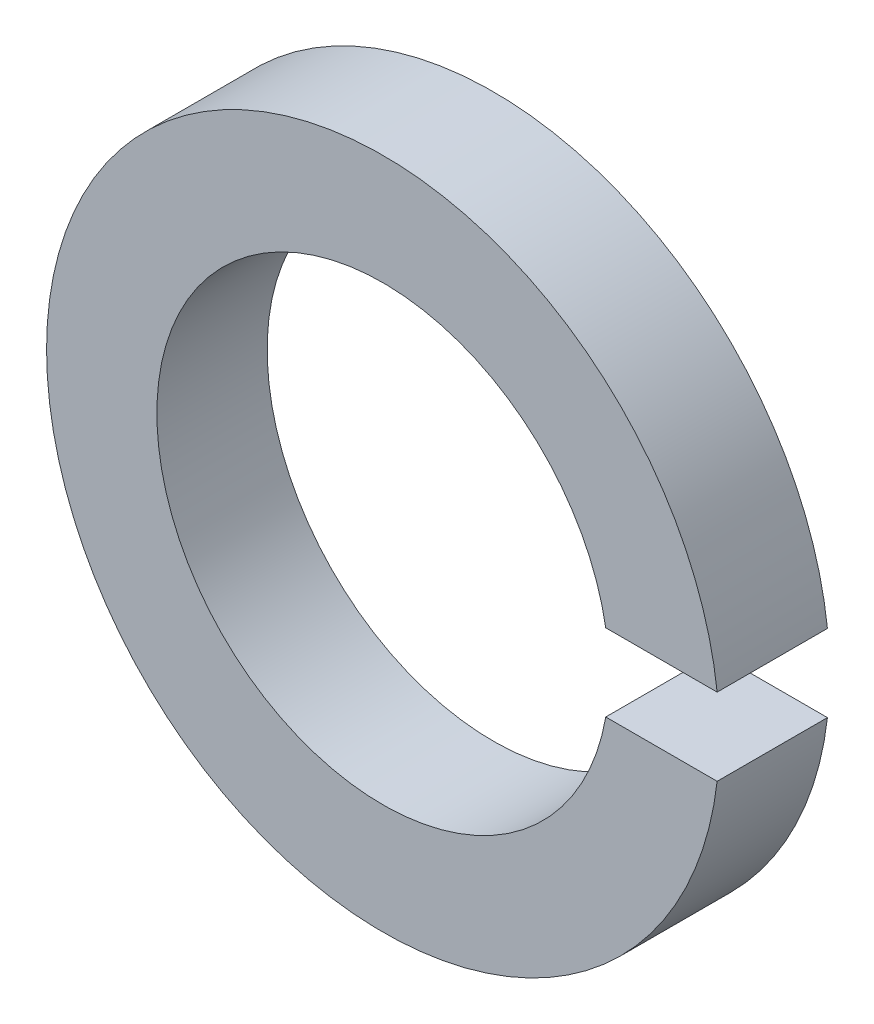
ISO-10303-21;
HEADER;
FILE_DESCRIPTION(('STEP AP214'),'2;1');
FILE_NAME('part.step','',(''),(''),'','','');
FILE_SCHEMA(('AUTOMOTIVE_DESIGN { 1 0 10303 214 1 1 1 1 }'));
ENDSEC;
DATA;
#1=APPLICATION_CONTEXT('core data for automotive mechanical design processes');
#2=APPLICATION_PROTOCOL_DEFINITION('international standard','automotive_design',2000,#1);
#3=PRODUCT_CONTEXT('',#1,'mechanical');
#4=PRODUCT('Part','Part','',(#3));
#5=PRODUCT_RELATED_PRODUCT_CATEGORY('part','',(#4));
#6=PRODUCT_DEFINITION_FORMATION('','',#4);
#7=PRODUCT_DEFINITION_CONTEXT('part definition',#1,'design');
#8=PRODUCT_DEFINITION('design','',#6,#7);
#9=PRODUCT_DEFINITION_SHAPE('','',#8);
#10=(LENGTH_UNIT() NAMED_UNIT(*) SI_UNIT(.MILLI.,.METRE.));
#11=(NAMED_UNIT(*) PLANE_ANGLE_UNIT() SI_UNIT($,.RADIAN.));
#12=(NAMED_UNIT(*) SI_UNIT($,.STERADIAN.) SOLID_ANGLE_UNIT());
#13=UNCERTAINTY_MEASURE_WITH_UNIT(LENGTH_MEASURE(1.E-05),#10,'distance_accuracy_value','');
#14=(GEOMETRIC_REPRESENTATION_CONTEXT(3) GLOBAL_UNCERTAINTY_ASSIGNED_CONTEXT((#13)) GLOBAL_UNIT_ASSIGNED_CONTEXT((#10,
#11,#12)) REPRESENTATION_CONTEXT('',''));
#15=CARTESIAN_POINT('',(0.,0.,0.));
#16=DIRECTION('',(0.,0.,1.));
#17=DIRECTION('',(1.,0.,0.));
#18=AXIS2_PLACEMENT_3D('',#15,#16,#17);
#19=CARTESIAN_POINT('',(0.,0.,1.));
#20=DIRECTION('',(0.,0.,1.));
#21=DIRECTION('',(1.,0.,0.));
#22=AXIS2_PLACEMENT_3D('',#19,#20,#21);
#23=PLANE('',#22);
#24=DIRECTION('',(-1.,0.,0.));
#25=VECTOR('',#24,1.);
#26=CARTESIAN_POINT('',(1.99720507012258,0.35,1.));
#27=LINE('',#26,#25);
#28=CARTESIAN_POINT('',(3.02985148150862,0.35,1.));
#29=VERTEX_POINT('',#28);
#30=CARTESIAN_POINT('',(2.01990098767242,0.35,1.));
#31=VERTEX_POINT('',#30);
#32=EDGE_CURVE('E50',#29,#31,#27,.T.);
#33=ORIENTED_EDGE('',*,*,#32,.F.);
#34=CARTESIAN_POINT('',(0.,0.,1.));
#35=DIRECTION('',(0.,0.,1.));
#36=DIRECTION('',(1.,0.,0.));
#37=AXIS2_PLACEMENT_3D('',#34,#35,#36);
#38=CIRCLE('',#37,3.05);
#39=CARTESIAN_POINT('',(3.02985148150862,-0.35,1.));
#40=VERTEX_POINT('',#39);
#41=EDGE_CURVE('E73',#29,#40,#38,.T.);
#42=ORIENTED_EDGE('',*,*,#41,.T.);
#43=DIRECTION('',(1.,0.,0.));
#44=VECTOR('',#43,1.);
#45=CARTESIAN_POINT('',(1.99720507012258,-0.35,1.));
#46=LINE('',#45,#44);
#47=CARTESIAN_POINT('',(2.01990098767242,-0.35,1.));
#48=VERTEX_POINT('',#47);
#49=EDGE_CURVE('E67',#48,#40,#46,.T.);
#50=ORIENTED_EDGE('',*,*,#49,.F.);
#51=CARTESIAN_POINT('',(0.,0.,1.));
#52=DIRECTION('',(0.,0.,1.));
#53=DIRECTION('',(1.,0.,0.));
#54=AXIS2_PLACEMENT_3D('',#51,#52,#53);
#55=CIRCLE('',#54,2.05);
#56=EDGE_CURVE('E77',#31,#48,#55,.T.);
#57=ORIENTED_EDGE('',*,*,#56,.F.);
#58=EDGE_LOOP('',(#33,#42,#50,#57));
#59=FACE_BOUND('',#58,.T.);
#60=ADVANCED_FACE('F28',(#59),#23,.T.);
#61=CARTESIAN_POINT('',(0.,0.,0.));
#62=DIRECTION('',(0.,0.,1.));
#63=DIRECTION('',(1.,0.,0.));
#64=AXIS2_PLACEMENT_3D('',#61,#62,#63);
#65=PLANE('',#64);
#66=CARTESIAN_POINT('',(0.,0.,0.));
#67=DIRECTION('',(0.,0.,1.));
#68=DIRECTION('',(1.,0.,0.));
#69=AXIS2_PLACEMENT_3D('',#66,#67,#68);
#70=CIRCLE('',#69,3.05);
#71=CARTESIAN_POINT('',(3.02985148150862,0.35,0.));
#72=VERTEX_POINT('',#71);
#73=CARTESIAN_POINT('',(3.02985148150862,-0.35,0.));
#74=VERTEX_POINT('',#73);
#75=EDGE_CURVE('E81',#72,#74,#70,.T.);
#76=ORIENTED_EDGE('',*,*,#75,.F.);
#77=DIRECTION('',(-1.,0.,0.));
#78=VECTOR('',#77,1.);
#79=CARTESIAN_POINT('',(1.99720507012258,0.35,0.));
#80=LINE('',#79,#78);
#81=CARTESIAN_POINT('',(2.01990098767242,0.35,0.));
#82=VERTEX_POINT('',#81);
#83=EDGE_CURVE('E94',#72,#82,#80,.T.);
#84=ORIENTED_EDGE('',*,*,#83,.T.);
#85=CARTESIAN_POINT('',(0.,0.,0.));
#86=DIRECTION('',(0.,0.,1.));
#87=DIRECTION('',(1.,0.,0.));
#88=AXIS2_PLACEMENT_3D('',#85,#86,#87);
#89=CIRCLE('',#88,2.05);
#90=CARTESIAN_POINT('',(2.01990098767242,-0.35,0.));
#91=VERTEX_POINT('',#90);
#92=EDGE_CURVE('E82',#82,#91,#89,.T.);
#93=ORIENTED_EDGE('',*,*,#92,.T.);
#94=DIRECTION('',(1.,0.,0.));
#95=VECTOR('',#94,1.);
#96=CARTESIAN_POINT('',(1.99720507012258,-0.35,0.));
#97=LINE('',#96,#95);
#98=EDGE_CURVE('E43',#91,#74,#97,.T.);
#99=ORIENTED_EDGE('',*,*,#98,.T.);
#100=EDGE_LOOP('',(#76,#84,#93,#99));
#101=FACE_BOUND('',#100,.T.);
#102=ADVANCED_FACE('F100',(#101),#65,.F.);
#103=CARTESIAN_POINT('',(0.,0.,1.));
#104=DIRECTION('',(0.,0.,-1.));
#105=DIRECTION('',(-1.,0.,0.));
#106=AXIS2_PLACEMENT_3D('',#103,#104,#105);
#107=CYLINDRICAL_SURFACE('',#106,3.05);
#108=ORIENTED_EDGE('',*,*,#41,.F.);
#109=DIRECTION('',(0.,0.,-1.));
#110=VECTOR('',#109,1.);
#111=CARTESIAN_POINT('',(3.02985148150862,0.35,1.));
#112=LINE('',#111,#110);
#113=EDGE_CURVE('E86',#29,#72,#112,.T.);
#114=ORIENTED_EDGE('',*,*,#113,.T.);
#115=ORIENTED_EDGE('',*,*,#75,.T.);
#116=DIRECTION('',(0.,0.,-1.));
#117=VECTOR('',#116,1.);
#118=CARTESIAN_POINT('',(3.02985148150862,-0.35,1.));
#119=LINE('',#118,#117);
#120=EDGE_CURVE('E92',#74,#40,#119,.F.);
#121=ORIENTED_EDGE('',*,*,#120,.T.);
#122=EDGE_LOOP('',(#108,#114,#115,#121));
#123=FACE_BOUND('',#122,.T.);
#124=ADVANCED_FACE('F30',(#123),#107,.T.);
#125=CARTESIAN_POINT('',(0.,0.,1.));
#126=DIRECTION('',(0.,0.,-1.));
#127=DIRECTION('',(-1.,0.,0.));
#128=AXIS2_PLACEMENT_3D('',#125,#126,#127);
#129=CYLINDRICAL_SURFACE('',#128,2.05);
#130=DIRECTION('',(0.,0.,-1.));
#131=VECTOR('',#130,1.);
#132=CARTESIAN_POINT('',(2.01990098767242,0.35,1.));
#133=LINE('',#132,#131);
#134=EDGE_CURVE('E11',#31,#82,#133,.T.);
#135=ORIENTED_EDGE('',*,*,#134,.F.);
#136=ORIENTED_EDGE('',*,*,#56,.T.);
#137=DIRECTION('',(0.,0.,-1.));
#138=VECTOR('',#137,1.);
#139=CARTESIAN_POINT('',(2.01990098767242,-0.35,1.));
#140=LINE('',#139,#138);
#141=EDGE_CURVE('E36',#91,#48,#140,.F.);
#142=ORIENTED_EDGE('',*,*,#141,.F.);
#143=ORIENTED_EDGE('',*,*,#92,.F.);
#144=EDGE_LOOP('',(#135,#136,#142,#143));
#145=FACE_BOUND('',#144,.T.);
#146=ADVANCED_FACE('F80',(#145),#129,.F.);
#147=CARTESIAN_POINT('',(1.99720507012258,-0.35,0.));
#148=DIRECTION('',(0.,-1.,0.));
#149=DIRECTION('',(0.,0.,-1.));
#150=AXIS2_PLACEMENT_3D('',#147,#148,#149);
#151=PLANE('',#150);
#152=ORIENTED_EDGE('',*,*,#98,.F.);
#153=ORIENTED_EDGE('',*,*,#141,.T.);
#154=ORIENTED_EDGE('',*,*,#49,.T.);
#155=ORIENTED_EDGE('',*,*,#120,.F.);
#156=EDGE_LOOP('',(#152,#153,#154,#155));
#157=FACE_BOUND('',#156,.T.);
#158=ADVANCED_FACE('F66',(#157),#151,.F.);
#159=CARTESIAN_POINT('',(1.99720507012258,0.35,0.));
#160=DIRECTION('',(0.,1.,0.));
#161=DIRECTION('',(0.,0.,1.));
#162=AXIS2_PLACEMENT_3D('',#159,#160,#161);
#163=PLANE('',#162);
#164=ORIENTED_EDGE('',*,*,#32,.T.);
#165=ORIENTED_EDGE('',*,*,#134,.T.);
#166=ORIENTED_EDGE('',*,*,#83,.F.);
#167=ORIENTED_EDGE('',*,*,#113,.F.);
#168=EDGE_LOOP('',(#164,#165,#166,#167));
#169=FACE_BOUND('',#168,.T.);
#170=ADVANCED_FACE('F102',(#169),#163,.F.);
#171=CLOSED_SHELL('',(#60,#102,#124,#146,#158,#170));
#172=MANIFOLD_SOLID_BREP('B2',#171);
#173=ADVANCED_BREP_SHAPE_REPRESENTATION('',(#18,#172),#14);
#174=SHAPE_DEFINITION_REPRESENTATION(#9,#173);
ENDSEC;
END-ISO-10303-21;
